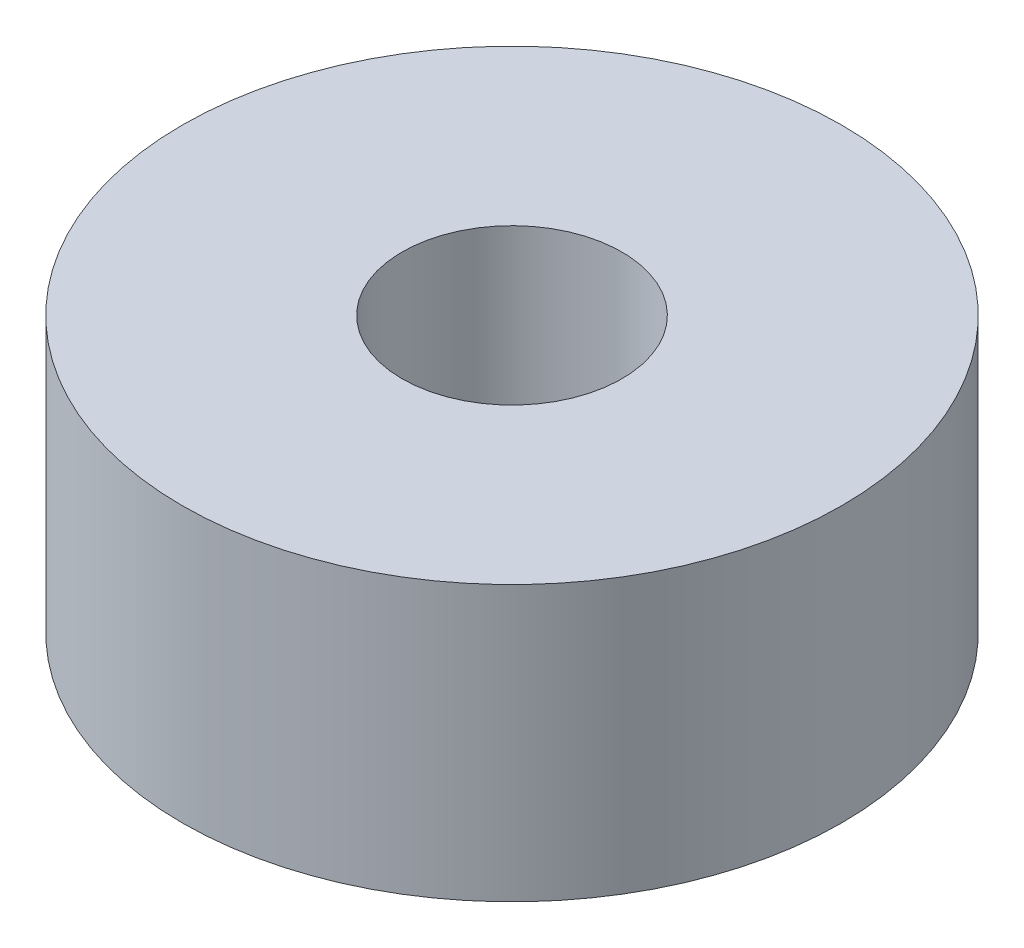
ISO-10303-21;
HEADER;
FILE_DESCRIPTION(('STEP AP214'),'2;1');
FILE_NAME('part.step','',(''),(''),'','','');
FILE_SCHEMA(('AUTOMOTIVE_DESIGN { 1 0 10303 214 1 1 1 1 }'));
ENDSEC;
DATA;
#1=APPLICATION_CONTEXT('core data for automotive mechanical design processes');
#2=APPLICATION_PROTOCOL_DEFINITION('international standard','automotive_design',2000,#1);
#3=PRODUCT_CONTEXT('',#1,'mechanical');
#4=PRODUCT('Part','Part','',(#3));
#5=PRODUCT_RELATED_PRODUCT_CATEGORY('part','',(#4));
#6=PRODUCT_DEFINITION_FORMATION('','',#4);
#7=PRODUCT_DEFINITION_CONTEXT('part definition',#1,'design');
#8=PRODUCT_DEFINITION('design','',#6,#7);
#9=PRODUCT_DEFINITION_SHAPE('','',#8);
#10=(LENGTH_UNIT() NAMED_UNIT(*) SI_UNIT(.MILLI.,.METRE.));
#11=(NAMED_UNIT(*) PLANE_ANGLE_UNIT() SI_UNIT($,.RADIAN.));
#12=(NAMED_UNIT(*) SI_UNIT($,.STERADIAN.) SOLID_ANGLE_UNIT());
#13=UNCERTAINTY_MEASURE_WITH_UNIT(LENGTH_MEASURE(1.E-05),#10,'distance_accuracy_value','');
#14=(GEOMETRIC_REPRESENTATION_CONTEXT(3) GLOBAL_UNCERTAINTY_ASSIGNED_CONTEXT((#13)) GLOBAL_UNIT_ASSIGNED_CONTEXT((#10,
#11,#12)) REPRESENTATION_CONTEXT('',''));
#15=CARTESIAN_POINT('',(0.,0.,0.));
#16=DIRECTION('',(0.,0.,1.));
#17=DIRECTION('',(1.,0.,0.));
#18=AXIS2_PLACEMENT_3D('',#15,#16,#17);
#19=CARTESIAN_POINT('',(0.,2.5,0.));
#20=DIRECTION('',(0.,1.,0.));
#21=DIRECTION('',(0.,0.,1.));
#22=AXIS2_PLACEMENT_3D('',#19,#20,#21);
#23=PLANE('',#22);
#24=CARTESIAN_POINT('',(0.,2.5,0.));
#25=DIRECTION('',(0.,1.,0.));
#26=DIRECTION('',(0.,0.,1.));
#27=AXIS2_PLACEMENT_3D('',#24,#25,#26);
#28=CIRCLE('',#27,3.);
#29=CARTESIAN_POINT('',(0.,2.5,3.));
#30=VERTEX_POINT('',#29);
#31=EDGE_CURVE('E10',#30,#30,#28,.T.);
#32=ORIENTED_EDGE('',*,*,#31,.T.);
#33=EDGE_LOOP('',(#32));
#34=FACE_BOUND('',#33,.T.);
#35=CARTESIAN_POINT('',(0.,2.5,0.));
#36=DIRECTION('',(0.,1.,0.));
#37=DIRECTION('',(0.,0.,1.));
#38=AXIS2_PLACEMENT_3D('',#35,#36,#37);
#39=CIRCLE('',#38,1.);
#40=CARTESIAN_POINT('',(0.,2.5,1.));
#41=VERTEX_POINT('',#40);
#42=EDGE_CURVE('E50',#41,#41,#39,.T.);
#43=ORIENTED_EDGE('',*,*,#42,.F.);
#44=EDGE_LOOP('',(#43));
#45=FACE_BOUND('',#44,.T.);
#46=ADVANCED_FACE('F37',(#34,#45),#23,.T.);
#47=CARTESIAN_POINT('',(0.,0.,0.));
#48=DIRECTION('',(0.,1.,0.));
#49=DIRECTION('',(0.,0.,1.));
#50=AXIS2_PLACEMENT_3D('',#47,#48,#49);
#51=PLANE('',#50);
#52=CARTESIAN_POINT('',(0.,0.,0.));
#53=DIRECTION('',(0.,1.,0.));
#54=DIRECTION('',(0.,0.,1.));
#55=AXIS2_PLACEMENT_3D('',#52,#53,#54);
#56=CIRCLE('',#55,3.);
#57=CARTESIAN_POINT('',(0.,0.,3.));
#58=VERTEX_POINT('',#57);
#59=EDGE_CURVE('E41',#58,#58,#56,.T.);
#60=ORIENTED_EDGE('',*,*,#59,.F.);
#61=EDGE_LOOP('',(#60));
#62=FACE_BOUND('',#61,.T.);
#63=CARTESIAN_POINT('',(0.,0.,0.));
#64=DIRECTION('',(0.,1.,0.));
#65=DIRECTION('',(0.,0.,1.));
#66=AXIS2_PLACEMENT_3D('',#63,#64,#65);
#67=CIRCLE('',#66,1.);
#68=CARTESIAN_POINT('',(0.,0.,1.));
#69=VERTEX_POINT('',#68);
#70=EDGE_CURVE('E52',#69,#69,#67,.T.);
#71=ORIENTED_EDGE('',*,*,#70,.T.);
#72=EDGE_LOOP('',(#71));
#73=FACE_BOUND('',#72,.T.);
#74=ADVANCED_FACE('F64',(#62,#73),#51,.F.);
#75=CARTESIAN_POINT('',(0.,2.5,0.));
#76=DIRECTION('',(0.,-1.,0.));
#77=DIRECTION('',(0.,0.,-1.));
#78=AXIS2_PLACEMENT_3D('',#75,#76,#77);
#79=CYLINDRICAL_SURFACE('',#78,3.);
#80=ORIENTED_EDGE('',*,*,#31,.F.);
#81=EDGE_LOOP('',(#80));
#82=FACE_BOUND('',#81,.T.);
#83=ORIENTED_EDGE('',*,*,#59,.T.);
#84=EDGE_LOOP('',(#83));
#85=FACE_BOUND('',#84,.T.);
#86=ADVANCED_FACE('F39',(#82,#85),#79,.T.);
#87=CARTESIAN_POINT('',(0.,2.5,0.));
#88=DIRECTION('',(0.,-1.,0.));
#89=DIRECTION('',(0.,0.,-1.));
#90=AXIS2_PLACEMENT_3D('',#87,#88,#89);
#91=CYLINDRICAL_SURFACE('',#90,1.);
#92=ORIENTED_EDGE('',*,*,#42,.T.);
#93=EDGE_LOOP('',(#92));
#94=FACE_BOUND('',#93,.T.);
#95=ORIENTED_EDGE('',*,*,#70,.F.);
#96=EDGE_LOOP('',(#95));
#97=FACE_BOUND('',#96,.T.);
#98=ADVANCED_FACE('F60',(#94,#97),#91,.F.);
#99=CLOSED_SHELL('',(#46,#74,#86,#98));
#100=MANIFOLD_SOLID_BREP('B2',#99);
#101=ADVANCED_BREP_SHAPE_REPRESENTATION('',(#18,#100),#14);
#102=SHAPE_DEFINITION_REPRESENTATION(#9,#101);
ENDSEC;
END-ISO-10303-21;
